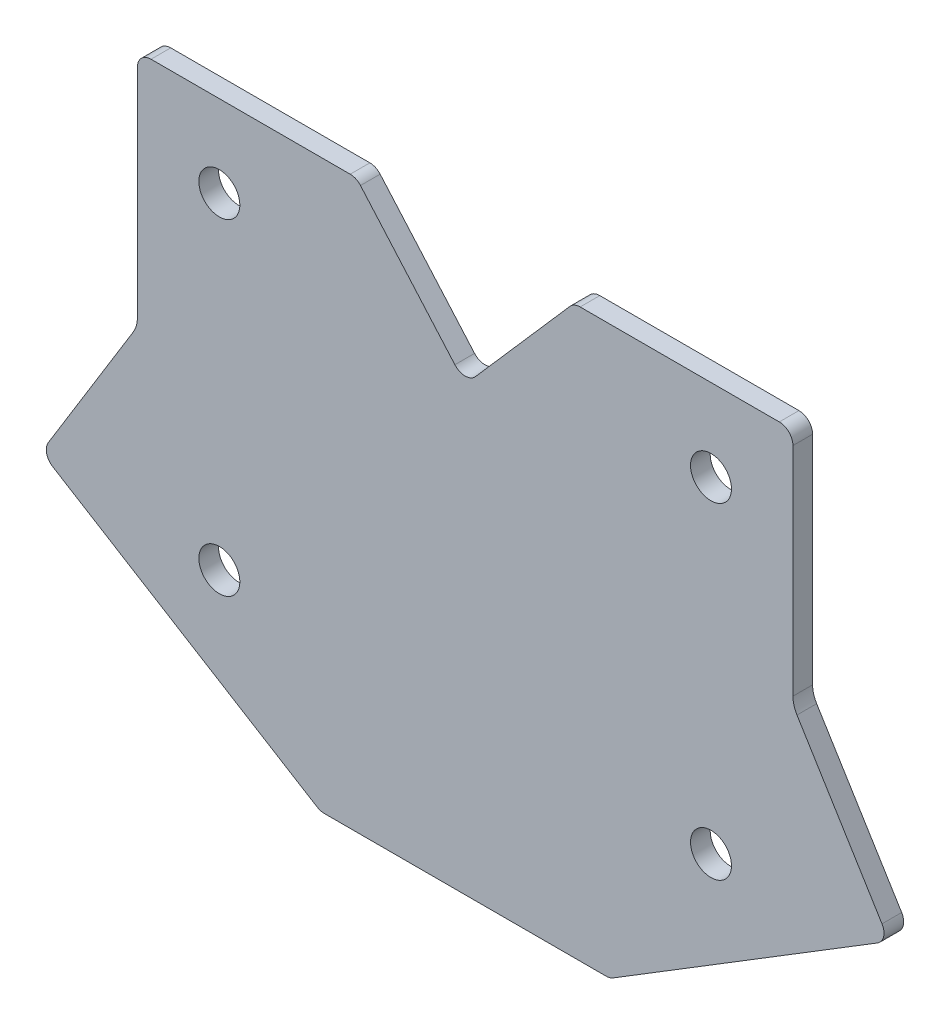
ISO-10303-21;
HEADER;
FILE_DESCRIPTION(('STEP AP214'),'2;1');
FILE_NAME('part.step','',(''),(''),'','','');
FILE_SCHEMA(('AUTOMOTIVE_DESIGN { 1 0 10303 214 1 1 1 1 }'));
ENDSEC;
DATA;
#1=APPLICATION_CONTEXT('core data for automotive mechanical design processes');
#2=APPLICATION_PROTOCOL_DEFINITION('international standard','automotive_design',2000,#1);
#3=PRODUCT_CONTEXT('',#1,'mechanical');
#4=PRODUCT('Part','Part','',(#3));
#5=PRODUCT_RELATED_PRODUCT_CATEGORY('part','',(#4));
#6=PRODUCT_DEFINITION_FORMATION('','',#4);
#7=PRODUCT_DEFINITION_CONTEXT('part definition',#1,'design');
#8=PRODUCT_DEFINITION('design','',#6,#7);
#9=PRODUCT_DEFINITION_SHAPE('','',#8);
#10=(LENGTH_UNIT() NAMED_UNIT(*) SI_UNIT(.MILLI.,.METRE.));
#11=(NAMED_UNIT(*) PLANE_ANGLE_UNIT() SI_UNIT($,.RADIAN.));
#12=(NAMED_UNIT(*) SI_UNIT($,.STERADIAN.) SOLID_ANGLE_UNIT());
#13=UNCERTAINTY_MEASURE_WITH_UNIT(LENGTH_MEASURE(1.E-05),#10,'distance_accuracy_value','');
#14=(GEOMETRIC_REPRESENTATION_CONTEXT(3) GLOBAL_UNCERTAINTY_ASSIGNED_CONTEXT((#13)) GLOBAL_UNIT_ASSIGNED_CONTEXT((#10,
#11,#12)) REPRESENTATION_CONTEXT('',''));
#15=CARTESIAN_POINT('',(0.,0.,0.));
#16=DIRECTION('',(0.,0.,1.));
#17=DIRECTION('',(1.,0.,0.));
#18=AXIS2_PLACEMENT_3D('',#15,#16,#17);
#19=CARTESIAN_POINT('',(-13.3633572147386,330.923698319184,-10.0795852621912));
#20=DIRECTION('',(0.,0.,1.));
#21=DIRECTION('',(1.,0.,0.));
#22=AXIS2_PLACEMENT_3D('',#19,#20,#21);
#23=CYLINDRICAL_SURFACE('',#22,1.5875);
#24=CARTESIAN_POINT('',(-13.3633572147386,330.923698319184,21.336));
#25=DIRECTION('',(0.,0.,1.));
#26=DIRECTION('',(1.,0.,0.));
#27=AXIS2_PLACEMENT_3D('',#24,#25,#26);
#28=CIRCLE('',#27,1.5875);
#29=CARTESIAN_POINT('',(-12.1680962513508,331.968450672329,21.336));
#30=VERTEX_POINT('',#29);
#31=CARTESIAN_POINT('',(-13.3633572147386,332.511198319184,21.336));
#32=VERTEX_POINT('',#31);
#33=EDGE_CURVE('E156',#30,#32,#28,.T.);
#34=ORIENTED_EDGE('',*,*,#33,.F.);
#35=DIRECTION('',(0.,0.,1.));
#36=VECTOR('',#35,1.);
#37=CARTESIAN_POINT('',(-12.1680962513508,331.968450672329,-10.0795852621912));
#38=LINE('',#37,#36);
#39=CARTESIAN_POINT('',(-12.1680962513508,331.968450672329,19.05));
#40=VERTEX_POINT('',#39);
#41=EDGE_CURVE('E243',#30,#40,#38,.F.);
#42=ORIENTED_EDGE('',*,*,#41,.T.);
#43=CARTESIAN_POINT('',(-13.3633572147386,330.923698319184,19.05));
#44=DIRECTION('',(0.,0.,1.));
#45=DIRECTION('',(1.,0.,0.));
#46=AXIS2_PLACEMENT_3D('',#43,#44,#45);
#47=CIRCLE('',#46,1.5875);
#48=CARTESIAN_POINT('',(-13.3633572147386,332.511198319184,19.05));
#49=VERTEX_POINT('',#48);
#50=EDGE_CURVE('E20',#40,#49,#47,.T.);
#51=ORIENTED_EDGE('',*,*,#50,.T.);
#52=DIRECTION('',(0.,0.,-1.));
#53=VECTOR('',#52,1.);
#54=CARTESIAN_POINT('',(-13.3633572147386,332.511198319184,21.336));
#55=LINE('',#54,#53);
#56=EDGE_CURVE('E237',#49,#32,#55,.F.);
#57=ORIENTED_EDGE('',*,*,#56,.T.);
#58=EDGE_LOOP('',(#34,#42,#51,#57));
#59=FACE_BOUND('',#58,.T.);
#60=ADVANCED_FACE('F17',(#59),#23,.T.);
#61=CARTESIAN_POINT('',(-47.1010606119022,287.12232454962,21.336));
#62=DIRECTION('',(0.,0.,-1.));
#63=DIRECTION('',(-1.,0.,0.));
#64=AXIS2_PLACEMENT_3D('',#61,#62,#63);
#65=CYLINDRICAL_SURFACE('',#64,1.5875);
#66=CARTESIAN_POINT('',(-47.1010606119022,287.12232454962,19.05));
#67=DIRECTION('',(0.,0.,-1.));
#68=DIRECTION('',(-1.,0.,0.));
#69=AXIS2_PLACEMENT_3D('',#66,#67,#68);
#70=CIRCLE('',#69,1.5875);
#71=CARTESIAN_POINT('',(-48.4535516847272,287.953543021461,19.05));
#72=VERTEX_POINT('',#71);
#73=CARTESIAN_POINT('',(-47.9322790837426,285.769833476795,19.05));
#74=VERTEX_POINT('',#73);
#75=EDGE_CURVE('E324',#72,#74,#70,.F.);
#76=ORIENTED_EDGE('',*,*,#75,.T.);
#77=DIRECTION('',(0.,0.,1.));
#78=VECTOR('',#77,1.);
#79=CARTESIAN_POINT('',(-47.9322790837426,285.769833476795,21.336));
#80=LINE('',#79,#78);
#81=CARTESIAN_POINT('',(-47.9322790837426,285.769833476795,21.336));
#82=VERTEX_POINT('',#81);
#83=EDGE_CURVE('E212',#74,#82,#80,.T.);
#84=ORIENTED_EDGE('',*,*,#83,.T.);
#85=CARTESIAN_POINT('',(-47.1010606119022,287.12232454962,21.336));
#86=DIRECTION('',(0.,0.,-1.));
#87=DIRECTION('',(-1.,0.,0.));
#88=AXIS2_PLACEMENT_3D('',#85,#86,#87);
#89=CIRCLE('',#88,1.5875);
#90=CARTESIAN_POINT('',(-48.4535516847272,287.953543021461,21.336));
#91=VERTEX_POINT('',#90);
#92=EDGE_CURVE('E317',#91,#82,#89,.F.);
#93=ORIENTED_EDGE('',*,*,#92,.F.);
#94=DIRECTION('',(0.,0.,1.));
#95=VECTOR('',#94,1.);
#96=CARTESIAN_POINT('',(-48.4535516847272,287.953543021461,21.336));
#97=LINE('',#96,#95);
#98=EDGE_CURVE('E218',#91,#72,#97,.F.);
#99=ORIENTED_EDGE('',*,*,#98,.T.);
#100=EDGE_LOOP('',(#76,#84,#93,#99));
#101=FACE_BOUND('',#100,.T.);
#102=ADVANCED_FACE('F429',(#101),#65,.T.);
#103=CARTESIAN_POINT('',(-16.3761533438558,268.239308624467,21.336));
#104=DIRECTION('',(0.,0.,-1.));
#105=DIRECTION('',(-1.,0.,0.));
#106=AXIS2_PLACEMENT_3D('',#103,#104,#105);
#107=CYLINDRICAL_SURFACE('',#106,1.5875);
#108=CARTESIAN_POINT('',(-16.3761533438558,268.239308624467,19.05));
#109=DIRECTION('',(0.,0.,-1.));
#110=DIRECTION('',(-1.,0.,0.));
#111=AXIS2_PLACEMENT_3D('',#108,#109,#110);
#112=CIRCLE('',#111,1.5875);
#113=CARTESIAN_POINT('',(-17.2073718156962,266.886817551642,19.05));
#114=VERTEX_POINT('',#113);
#115=CARTESIAN_POINT('',(-16.3761533438558,266.651808624467,19.05));
#116=VERTEX_POINT('',#115);
#117=EDGE_CURVE('E323',#114,#116,#112,.F.);
#118=ORIENTED_EDGE('',*,*,#117,.T.);
#119=DIRECTION('',(0.,0.,1.));
#120=VECTOR('',#119,1.);
#121=CARTESIAN_POINT('',(-16.3761533438558,266.651808624467,21.336));
#122=LINE('',#121,#120);
#123=CARTESIAN_POINT('',(-16.3761533438558,266.651808624467,21.336));
#124=VERTEX_POINT('',#123);
#125=EDGE_CURVE('E205',#116,#124,#122,.T.);
#126=ORIENTED_EDGE('',*,*,#125,.T.);
#127=CARTESIAN_POINT('',(-16.3761533438558,268.239308624467,21.336));
#128=DIRECTION('',(0.,0.,-1.));
#129=DIRECTION('',(-1.,0.,0.));
#130=AXIS2_PLACEMENT_3D('',#127,#128,#129);
#131=CIRCLE('',#130,1.5875);
#132=CARTESIAN_POINT('',(-17.2073718156962,266.886817551642,21.336));
#133=VERTEX_POINT('',#132);
#134=EDGE_CURVE('E315',#133,#124,#131,.F.);
#135=ORIENTED_EDGE('',*,*,#134,.F.);
#136=DIRECTION('',(0.,0.,1.));
#137=VECTOR('',#136,1.);
#138=CARTESIAN_POINT('',(-17.2073718156962,266.886817551642,21.336));
#139=LINE('',#138,#137);
#140=EDGE_CURVE('E215',#133,#114,#139,.F.);
#141=ORIENTED_EDGE('',*,*,#140,.T.);
#142=EDGE_LOOP('',(#118,#126,#135,#141));
#143=FACE_BOUND('',#142,.T.);
#144=ADVANCED_FACE('F422',(#143),#107,.T.);
#145=CARTESIAN_POINT('',(16.3761533438557,268.239308624467,21.336));
#146=DIRECTION('',(0.,0.,-1.));
#147=DIRECTION('',(-1.,0.,0.));
#148=AXIS2_PLACEMENT_3D('',#145,#146,#147);
#149=CYLINDRICAL_SURFACE('',#148,1.5875);
#150=CARTESIAN_POINT('',(16.3761533438557,268.239308624467,19.05));
#151=DIRECTION('',(0.,0.,-1.));
#152=DIRECTION('',(-1.,0.,0.));
#153=AXIS2_PLACEMENT_3D('',#150,#151,#152);
#154=CIRCLE('',#153,1.5875);
#155=CARTESIAN_POINT('',(16.3761533438557,266.651808624467,19.05));
#156=VERTEX_POINT('',#155);
#157=CARTESIAN_POINT('',(17.2073718156961,266.886817551642,19.05));
#158=VERTEX_POINT('',#157);
#159=EDGE_CURVE('E321',#156,#158,#154,.F.);
#160=ORIENTED_EDGE('',*,*,#159,.T.);
#161=DIRECTION('',(0.,0.,1.));
#162=VECTOR('',#161,1.);
#163=CARTESIAN_POINT('',(17.2073718156961,266.886817551642,21.336));
#164=LINE('',#163,#162);
#165=CARTESIAN_POINT('',(17.2073718156961,266.886817551642,21.336));
#166=VERTEX_POINT('',#165);
#167=EDGE_CURVE('E200',#158,#166,#164,.T.);
#168=ORIENTED_EDGE('',*,*,#167,.T.);
#169=CARTESIAN_POINT('',(16.3761533438557,268.239308624467,21.336));
#170=DIRECTION('',(0.,0.,-1.));
#171=DIRECTION('',(-1.,0.,0.));
#172=AXIS2_PLACEMENT_3D('',#169,#170,#171);
#173=CIRCLE('',#172,1.5875);
#174=CARTESIAN_POINT('',(16.3761533438557,266.651808624467,21.336));
#175=VERTEX_POINT('',#174);
#176=EDGE_CURVE('E313',#175,#166,#173,.F.);
#177=ORIENTED_EDGE('',*,*,#176,.F.);
#178=DIRECTION('',(0.,0.,1.));
#179=VECTOR('',#178,1.);
#180=CARTESIAN_POINT('',(16.3761533438557,266.651808624467,21.336));
#181=LINE('',#180,#179);
#182=EDGE_CURVE('E204',#175,#156,#181,.F.);
#183=ORIENTED_EDGE('',*,*,#182,.T.);
#184=EDGE_LOOP('',(#160,#168,#177,#183));
#185=FACE_BOUND('',#184,.T.);
#186=ADVANCED_FACE('F412',(#185),#149,.T.);
#187=CARTESIAN_POINT('',(13.3633572147386,330.923698319184,21.336));
#188=DIRECTION('',(0.,0.,1.));
#189=DIRECTION('',(1.,0.,0.));
#190=AXIS2_PLACEMENT_3D('',#187,#188,#189);
#191=CYLINDRICAL_SURFACE('',#190,1.5875);
#192=CARTESIAN_POINT('',(13.3633572147386,330.923698319184,21.336));
#193=DIRECTION('',(0.,0.,1.));
#194=DIRECTION('',(1.,0.,0.));
#195=AXIS2_PLACEMENT_3D('',#192,#193,#194);
#196=CIRCLE('',#195,1.5875);
#197=CARTESIAN_POINT('',(13.3633572147386,332.511198319184,21.336));
#198=VERTEX_POINT('',#197);
#199=CARTESIAN_POINT('',(12.1680962513509,331.968450672329,21.336));
#200=VERTEX_POINT('',#199);
#201=EDGE_CURVE('E148',#198,#200,#196,.T.);
#202=ORIENTED_EDGE('',*,*,#201,.F.);
#203=DIRECTION('',(0.,0.,-1.));
#204=VECTOR('',#203,1.);
#205=CARTESIAN_POINT('',(13.3633572147386,332.511198319184,21.336));
#206=LINE('',#205,#204);
#207=CARTESIAN_POINT('',(13.3633572147386,332.511198319184,19.05));
#208=VERTEX_POINT('',#207);
#209=EDGE_CURVE('E170',#198,#208,#206,.T.);
#210=ORIENTED_EDGE('',*,*,#209,.T.);
#211=CARTESIAN_POINT('',(13.3633572147386,330.923698319184,19.05));
#212=DIRECTION('',(0.,0.,1.));
#213=DIRECTION('',(1.,0.,0.));
#214=AXIS2_PLACEMENT_3D('',#211,#212,#213);
#215=CIRCLE('',#214,1.5875);
#216=CARTESIAN_POINT('',(12.1680962513509,331.968450672329,19.05));
#217=VERTEX_POINT('',#216);
#218=EDGE_CURVE('E35',#208,#217,#215,.T.);
#219=ORIENTED_EDGE('',*,*,#218,.T.);
#220=DIRECTION('',(0.,0.,1.));
#221=VECTOR('',#220,1.);
#222=CARTESIAN_POINT('',(12.1680962513508,331.968450672329,-10.0795852621912));
#223=LINE('',#222,#221);
#224=EDGE_CURVE('E162',#217,#200,#223,.T.);
#225=ORIENTED_EDGE('',*,*,#224,.T.);
#226=EDGE_LOOP('',(#202,#210,#219,#225));
#227=FACE_BOUND('',#226,.T.);
#228=ADVANCED_FACE('F168',(#227),#191,.T.);
#229=CARTESIAN_POINT('',(-41.275,305.697662129823,21.336));
#230=DIRECTION('',(0.,0.,1.));
#231=DIRECTION('',(1.,0.,0.));
#232=AXIS2_PLACEMENT_3D('',#229,#230,#231);
#233=PLANE('',#232);
#234=CARTESIAN_POINT('',(-28.5749999999999,322.986198319184,21.336));
#235=DIRECTION('',(0.,0.,-1.));
#236=DIRECTION('',(-1.,0.,0.));
#237=AXIS2_PLACEMENT_3D('',#234,#235,#236);
#238=CIRCLE('',#237,2.38125000000002);
#239=CARTESIAN_POINT('',(-30.9562499999999,322.986198319184,21.336));
#240=VERTEX_POINT('',#239);
#241=EDGE_CURVE('E296',#240,#240,#238,.T.);
#242=ORIENTED_EDGE('',*,*,#241,.T.);
#243=EDGE_LOOP('',(#242));
#244=FACE_BOUND('',#243,.T.);
#245=CARTESIAN_POINT('',(28.5749999999999,322.986198319184,21.336));
#246=DIRECTION('',(0.,0.,-1.));
#247=DIRECTION('',(-1.,0.,0.));
#248=AXIS2_PLACEMENT_3D('',#245,#246,#247);
#249=CIRCLE('',#248,2.38125000000002);
#250=CARTESIAN_POINT('',(26.1937499999999,322.986198319184,21.336));
#251=VERTEX_POINT('',#250);
#252=EDGE_CURVE('E302',#251,#251,#249,.T.);
#253=ORIENTED_EDGE('',*,*,#252,.T.);
#254=EDGE_LOOP('',(#253));
#255=FACE_BOUND('',#254,.T.);
#256=CARTESIAN_POINT('',(28.5749999999999,285.053236925106,21.336));
#257=DIRECTION('',(0.,0.,-1.));
#258=DIRECTION('',(-1.,0.,0.));
#259=AXIS2_PLACEMENT_3D('',#256,#257,#258);
#260=CIRCLE('',#259,2.38125000000002);
#261=CARTESIAN_POINT('',(26.1937499999999,285.053236925106,21.336));
#262=VERTEX_POINT('',#261);
#263=EDGE_CURVE('E166',#262,#262,#260,.T.);
#264=ORIENTED_EDGE('',*,*,#263,.T.);
#265=EDGE_LOOP('',(#264));
#266=FACE_BOUND('',#265,.T.);
#267=CARTESIAN_POINT('',(-28.5749999999999,285.053236925106,21.336));
#268=DIRECTION('',(0.,0.,-1.));
#269=DIRECTION('',(-1.,0.,0.));
#270=AXIS2_PLACEMENT_3D('',#267,#268,#269);
#271=CIRCLE('',#270,2.38125000000002);
#272=CARTESIAN_POINT('',(-30.9562499999999,285.053236925106,21.336));
#273=VERTEX_POINT('',#272);
#274=EDGE_CURVE('E299',#273,#273,#271,.T.);
#275=ORIENTED_EDGE('',*,*,#274,.T.);
#276=EDGE_LOOP('',(#275));
#277=FACE_BOUND('',#276,.T.);
#278=DIRECTION('',(0.,1.,0.));
#279=VECTOR('',#278,1.);
#280=CARTESIAN_POINT('',(38.1,305.697662129823,21.336));
#281=LINE('',#280,#279);
#282=CARTESIAN_POINT('',(38.1,305.697662129823,21.336));
#283=VERTEX_POINT('',#282);
#284=CARTESIAN_POINT('',(38.1,330.923698319184,21.336));
#285=VERTEX_POINT('',#284);
#286=EDGE_CURVE('E187',#283,#285,#281,.T.);
#287=ORIENTED_EDGE('',*,*,#286,.T.);
#288=CARTESIAN_POINT('',(36.5125,330.923698319184,21.336));
#289=DIRECTION('',(0.,0.,-1.));
#290=DIRECTION('',(-1.,0.,0.));
#291=AXIS2_PLACEMENT_3D('',#288,#289,#290);
#292=CIRCLE('',#291,1.5875);
#293=CARTESIAN_POINT('',(36.5125,332.511198319184,21.336));
#294=VERTEX_POINT('',#293);
#295=EDGE_CURVE('E183',#294,#285,#292,.T.);
#296=ORIENTED_EDGE('',*,*,#295,.F.);
#297=DIRECTION('',(1.,0.,0.));
#298=VECTOR('',#297,1.);
#299=CARTESIAN_POINT('',(-38.0999999999999,332.511198319184,21.336));
#300=LINE('',#299,#298);
#301=EDGE_CURVE('E154',#294,#198,#300,.F.);
#302=ORIENTED_EDGE('',*,*,#301,.T.);
#303=ORIENTED_EDGE('',*,*,#201,.T.);
#304=DIRECTION('',(0.658111718516371,0.752920291897774,0.));
#305=VECTOR('',#304,1.);
#306=CARTESIAN_POINT('',(0.,318.047400000171,21.336));
#307=LINE('',#306,#305);
#308=CARTESIAN_POINT('',(1.1952609633877,319.414852072711,21.336));
#309=VERTEX_POINT('',#308);
#310=EDGE_CURVE('E152',#200,#309,#307,.F.);
#311=ORIENTED_EDGE('',*,*,#310,.T.);
#312=CARTESIAN_POINT('',(0.,320.459604425855,21.336));
#313=DIRECTION('',(0.,0.,-1.));
#314=DIRECTION('',(-1.,0.,0.));
#315=AXIS2_PLACEMENT_3D('',#312,#313,#314);
#316=CIRCLE('',#315,1.5875);
#317=CARTESIAN_POINT('',(-1.19526096338775,319.414852072711,21.336));
#318=VERTEX_POINT('',#317);
#319=EDGE_CURVE('E244',#309,#318,#316,.T.);
#320=ORIENTED_EDGE('',*,*,#319,.T.);
#321=DIRECTION('',(0.658111718516369,-0.752920291897775,0.));
#322=VECTOR('',#321,1.);
#323=CARTESIAN_POINT('',(-12.6425005016233,332.511198319184,21.336));
#324=LINE('',#323,#322);
#325=EDGE_CURVE('E241',#318,#30,#324,.F.);
#326=ORIENTED_EDGE('',*,*,#325,.T.);
#327=ORIENTED_EDGE('',*,*,#33,.T.);
#328=DIRECTION('',(1.,0.,0.));
#329=VECTOR('',#328,1.);
#330=CARTESIAN_POINT('',(-38.0999999999999,332.511198319184,21.336));
#331=LINE('',#330,#329);
#332=CARTESIAN_POINT('',(-36.5124999999999,332.511198319184,21.336));
#333=VERTEX_POINT('',#332);
#334=EDGE_CURVE('E240',#32,#333,#331,.F.);
#335=ORIENTED_EDGE('',*,*,#334,.T.);
#336=CARTESIAN_POINT('',(-36.5124999999999,330.923698319184,21.336));
#337=DIRECTION('',(0.,0.,-1.));
#338=DIRECTION('',(-1.,0.,0.));
#339=AXIS2_PLACEMENT_3D('',#336,#337,#338);
#340=CIRCLE('',#339,1.5875);
#341=CARTESIAN_POINT('',(-38.0999999999999,330.923698319184,21.336));
#342=VERTEX_POINT('',#341);
#343=EDGE_CURVE('E236',#342,#333,#340,.T.);
#344=ORIENTED_EDGE('',*,*,#343,.F.);
#345=DIRECTION('',(0.,1.,0.));
#346=VECTOR('',#345,1.);
#347=CARTESIAN_POINT('',(-38.1,305.697662129823,21.336));
#348=LINE('',#347,#346);
#349=CARTESIAN_POINT('',(-38.1,305.697662129823,21.336));
#350=VERTEX_POINT('',#349);
#351=EDGE_CURVE('E229',#342,#350,#348,.F.);
#352=ORIENTED_EDGE('',*,*,#351,.T.);
#353=CARTESIAN_POINT('',(-41.275,305.697662129823,21.336));
#354=DIRECTION('',(0.,0.,-1.));
#355=DIRECTION('',(-1.,0.,0.));
#356=AXIS2_PLACEMENT_3D('',#353,#354,#355);
#357=CIRCLE('',#356,3.17499999999999);
#358=CARTESIAN_POINT('',(-38.57001785435,304.035225186142,21.336));
#359=VERTEX_POINT('',#358);
#360=EDGE_CURVE('E223',#350,#359,#357,.T.);
#361=ORIENTED_EDGE('',*,*,#360,.T.);
#362=DIRECTION('',(0.52360218698606,0.851962880519694,0.));
#363=VECTOR('',#362,1.);
#364=CARTESIAN_POINT('',(-49.2847701565676,286.601051948636,21.336));
#365=LINE('',#364,#363);
#366=EDGE_CURVE('E222',#359,#91,#365,.F.);
#367=ORIENTED_EDGE('',*,*,#366,.T.);
#368=ORIENTED_EDGE('',*,*,#92,.T.);
#369=DIRECTION('',(-0.851962880519694,0.523602186986061,0.));
#370=VECTOR('',#369,1.);
#371=CARTESIAN_POINT('',(-49.2847701565676,286.601051948636,21.336));
#372=LINE('',#371,#370);
#373=EDGE_CURVE('E209',#82,#133,#372,.F.);
#374=ORIENTED_EDGE('',*,*,#373,.T.);
#375=ORIENTED_EDGE('',*,*,#134,.T.);
#376=DIRECTION('',(1.,0.,0.));
#377=VECTOR('',#376,1.);
#378=CARTESIAN_POINT('',(-16.8249844087674,266.651808624467,21.336));
#379=LINE('',#378,#377);
#380=EDGE_CURVE('E208',#124,#175,#379,.T.);
#381=ORIENTED_EDGE('',*,*,#380,.T.);
#382=ORIENTED_EDGE('',*,*,#176,.T.);
#383=DIRECTION('',(-0.851962880519693,-0.523602186986061,0.));
#384=VECTOR('',#383,1.);
#385=CARTESIAN_POINT('',(16.8249844087673,266.651808624467,21.336));
#386=LINE('',#385,#384);
#387=CARTESIAN_POINT('',(47.9322790837426,285.769833476795,21.336));
#388=VERTEX_POINT('',#387);
#389=EDGE_CURVE('E203',#166,#388,#386,.F.);
#390=ORIENTED_EDGE('',*,*,#389,.T.);
#391=CARTESIAN_POINT('',(47.1010606119022,287.12232454962,21.336));
#392=DIRECTION('',(0.,0.,-1.));
#393=DIRECTION('',(-1.,0.,0.));
#394=AXIS2_PLACEMENT_3D('',#391,#392,#393);
#395=CIRCLE('',#394,1.5875);
#396=CARTESIAN_POINT('',(48.4535516847272,287.953543021461,21.336));
#397=VERTEX_POINT('',#396);
#398=EDGE_CURVE('E199',#397,#388,#395,.T.);
#399=ORIENTED_EDGE('',*,*,#398,.F.);
#400=DIRECTION('',(0.523602186986061,-0.851962880519694,0.));
#401=VECTOR('',#400,1.);
#402=CARTESIAN_POINT('',(49.2847701565676,286.601051948636,21.336));
#403=LINE('',#402,#401);
#404=CARTESIAN_POINT('',(38.57001785435,304.035225186142,21.336));
#405=VERTEX_POINT('',#404);
#406=EDGE_CURVE('E192',#397,#405,#403,.F.);
#407=ORIENTED_EDGE('',*,*,#406,.T.);
#408=CARTESIAN_POINT('',(41.275,305.697662129823,21.336));
#409=DIRECTION('',(0.,0.,-1.));
#410=DIRECTION('',(-1.,0.,0.));
#411=AXIS2_PLACEMENT_3D('',#408,#409,#410);
#412=CIRCLE('',#411,3.17499999999998);
#413=EDGE_CURVE('E188',#405,#283,#412,.T.);
#414=ORIENTED_EDGE('',*,*,#413,.T.);
#415=EDGE_LOOP('',(#287,#296,#302,#303,#311,#320,#326,#327,#335,#344,#352,#361,#367,#368,#374,
#375,#381,#382,#390,#399,#407,#414));
#416=FACE_BOUND('',#415,.T.);
#417=ADVANCED_FACE('F151',(#244,#255,#266,#277,#416),#233,.T.);
#418=CARTESIAN_POINT('',(0.,320.459604425855,-10.0795852621912));
#419=DIRECTION('',(0.,0.,-1.));
#420=DIRECTION('',(-1.,0.,0.));
#421=AXIS2_PLACEMENT_3D('',#418,#419,#420);
#422=CYLINDRICAL_SURFACE('',#421,1.5875);
#423=DIRECTION('',(0.,0.,1.));
#424=VECTOR('',#423,1.);
#425=CARTESIAN_POINT('',(-1.19526096338775,319.414852072711,-10.0795852621912));
#426=LINE('',#425,#424);
#427=CARTESIAN_POINT('',(-1.19526096338774,319.414852072711,19.05));
#428=VERTEX_POINT('',#427);
#429=EDGE_CURVE('E76',#428,#318,#426,.T.);
#430=ORIENTED_EDGE('',*,*,#429,.T.);
#431=ORIENTED_EDGE('',*,*,#319,.F.);
#432=DIRECTION('',(0.,0.,1.));
#433=VECTOR('',#432,1.);
#434=CARTESIAN_POINT('',(1.1952609633877,319.414852072711,-10.0795852621912));
#435=LINE('',#434,#433);
#436=CARTESIAN_POINT('',(1.1952609633877,319.414852072711,19.05));
#437=VERTEX_POINT('',#436);
#438=EDGE_CURVE('E165',#309,#437,#435,.F.);
#439=ORIENTED_EDGE('',*,*,#438,.T.);
#440=CARTESIAN_POINT('',(0.,320.459604425855,19.05));
#441=DIRECTION('',(0.,0.,-1.));
#442=DIRECTION('',(-1.,0.,0.));
#443=AXIS2_PLACEMENT_3D('',#440,#441,#442);
#444=CIRCLE('',#443,1.5875);
#445=EDGE_CURVE('E293',#437,#428,#444,.T.);
#446=ORIENTED_EDGE('',*,*,#445,.T.);
#447=EDGE_LOOP('',(#430,#431,#439,#446));
#448=FACE_BOUND('',#447,.T.);
#449=ADVANCED_FACE('F359',(#448),#422,.F.);
#450=CARTESIAN_POINT('',(-12.6425005016233,332.511198319184,-10.0795852621912));
#451=DIRECTION('',(-0.752920291897775,-0.658111718516369,0.));
#452=DIRECTION('',(0.658111718516369,-0.752920291897775,0.));
#453=AXIS2_PLACEMENT_3D('',#450,#451,#452);
#454=PLANE('',#453);
#455=ORIENTED_EDGE('',*,*,#429,.F.);
#456=DIRECTION('',(-0.65811171851637,0.752920291897775,0.));
#457=VECTOR('',#456,1.);
#458=CARTESIAN_POINT('',(-1.19526096338775,319.414852072711,19.05));
#459=LINE('',#458,#457);
#460=EDGE_CURVE('E173',#428,#40,#459,.T.);
#461=ORIENTED_EDGE('',*,*,#460,.T.);
#462=ORIENTED_EDGE('',*,*,#41,.F.);
#463=ORIENTED_EDGE('',*,*,#325,.F.);
#464=EDGE_LOOP('',(#455,#461,#462,#463));
#465=FACE_BOUND('',#464,.T.);
#466=ADVANCED_FACE('F360',(#465),#454,.F.);
#467=CARTESIAN_POINT('',(-38.0999999999999,332.511198319184,21.336));
#468=DIRECTION('',(0.,-1.,0.));
#469=DIRECTION('',(0.,0.,-1.));
#470=AXIS2_PLACEMENT_3D('',#467,#468,#469);
#471=PLANE('',#470);
#472=ORIENTED_EDGE('',*,*,#56,.F.);
#473=DIRECTION('',(1.,0.,0.));
#474=VECTOR('',#473,1.);
#475=CARTESIAN_POINT('',(-41.275,332.511198319184,19.05));
#476=LINE('',#475,#474);
#477=CARTESIAN_POINT('',(-36.5124999999999,332.511198319184,19.05));
#478=VERTEX_POINT('',#477);
#479=EDGE_CURVE('E292',#49,#478,#476,.F.);
#480=ORIENTED_EDGE('',*,*,#479,.T.);
#481=DIRECTION('',(0.,0.,-1.));
#482=VECTOR('',#481,1.);
#483=CARTESIAN_POINT('',(-36.5124999999999,332.511198319184,21.336));
#484=LINE('',#483,#482);
#485=EDGE_CURVE('E233',#333,#478,#484,.T.);
#486=ORIENTED_EDGE('',*,*,#485,.F.);
#487=ORIENTED_EDGE('',*,*,#334,.F.);
#488=EDGE_LOOP('',(#472,#480,#486,#487));
#489=FACE_BOUND('',#488,.T.);
#490=ADVANCED_FACE('F333',(#489),#471,.F.);
#491=CARTESIAN_POINT('',(-36.5124999999999,330.923698319184,21.336));
#492=DIRECTION('',(0.,0.,-1.));
#493=DIRECTION('',(-1.,0.,0.));
#494=AXIS2_PLACEMENT_3D('',#491,#492,#493);
#495=CYLINDRICAL_SURFACE('',#494,1.5875);
#496=CARTESIAN_POINT('',(-36.5124999999999,330.923698319184,19.05));
#497=DIRECTION('',(0.,0.,-1.));
#498=DIRECTION('',(-1.,0.,0.));
#499=AXIS2_PLACEMENT_3D('',#496,#497,#498);
#500=CIRCLE('',#499,1.5875);
#501=CARTESIAN_POINT('',(-38.0999999999999,330.923698319184,19.05));
#502=VERTEX_POINT('',#501);
#503=EDGE_CURVE('E289',#478,#502,#500,.F.);
#504=ORIENTED_EDGE('',*,*,#503,.T.);
#505=DIRECTION('',(0.,0.,1.));
#506=VECTOR('',#505,1.);
#507=CARTESIAN_POINT('',(-38.0999999999999,330.923698319184,21.336));
#508=LINE('',#507,#506);
#509=EDGE_CURVE('E230',#502,#342,#508,.T.);
#510=ORIENTED_EDGE('',*,*,#509,.T.);
#511=ORIENTED_EDGE('',*,*,#343,.T.);
#512=ORIENTED_EDGE('',*,*,#485,.T.);
#513=EDGE_LOOP('',(#504,#510,#511,#512));
#514=FACE_BOUND('',#513,.T.);
#515=ADVANCED_FACE('F363',(#514),#495,.T.);
#516=CARTESIAN_POINT('',(-38.1,305.697662129823,21.336));
#517=DIRECTION('',(1.,0.,0.));
#518=DIRECTION('',(0.,1.,0.));
#519=AXIS2_PLACEMENT_3D('',#516,#517,#518);
#520=PLANE('',#519);
#521=ORIENTED_EDGE('',*,*,#509,.F.);
#522=DIRECTION('',(0.,1.,0.));
#523=VECTOR('',#522,1.);
#524=CARTESIAN_POINT('',(-38.0999999999999,305.697662129823,19.05));
#525=LINE('',#524,#523);
#526=CARTESIAN_POINT('',(-38.1,305.697662129823,19.05));
#527=VERTEX_POINT('',#526);
#528=EDGE_CURVE('E288',#502,#527,#525,.F.);
#529=ORIENTED_EDGE('',*,*,#528,.T.);
#530=DIRECTION('',(0.,0.,-1.));
#531=VECTOR('',#530,1.);
#532=CARTESIAN_POINT('',(-38.1,305.697662129823,21.336));
#533=LINE('',#532,#531);
#534=EDGE_CURVE('E226',#527,#350,#533,.F.);
#535=ORIENTED_EDGE('',*,*,#534,.T.);
#536=ORIENTED_EDGE('',*,*,#351,.F.);
#537=EDGE_LOOP('',(#521,#529,#535,#536));
#538=FACE_BOUND('',#537,.T.);
#539=ADVANCED_FACE('F437',(#538),#520,.F.);
#540=CARTESIAN_POINT('',(-41.275,305.697662129823,21.336));
#541=DIRECTION('',(0.,0.,-1.));
#542=DIRECTION('',(-1.,0.,0.));
#543=AXIS2_PLACEMENT_3D('',#540,#541,#542);
#544=CYLINDRICAL_SURFACE('',#543,3.17499999999999);
#545=DIRECTION('',(0.,0.,1.));
#546=VECTOR('',#545,1.);
#547=CARTESIAN_POINT('',(-38.57001785435,304.035225186142,21.336));
#548=LINE('',#547,#546);
#549=CARTESIAN_POINT('',(-38.57001785435,304.035225186142,19.05));
#550=VERTEX_POINT('',#549);
#551=EDGE_CURVE('E219',#550,#359,#548,.T.);
#552=ORIENTED_EDGE('',*,*,#551,.T.);
#553=ORIENTED_EDGE('',*,*,#360,.F.);
#554=ORIENTED_EDGE('',*,*,#534,.F.);
#555=CARTESIAN_POINT('',(-41.275,305.697662129823,19.05));
#556=DIRECTION('',(0.,0.,-1.));
#557=DIRECTION('',(-1.,0.,0.));
#558=AXIS2_PLACEMENT_3D('',#555,#556,#557);
#559=CIRCLE('',#558,3.17499999999999);
#560=EDGE_CURVE('E284',#527,#550,#559,.T.);
#561=ORIENTED_EDGE('',*,*,#560,.T.);
#562=EDGE_LOOP('',(#552,#553,#554,#561));
#563=FACE_BOUND('',#562,.T.);
#564=ADVANCED_FACE('F435',(#563),#544,.F.);
#565=CARTESIAN_POINT('',(-49.2847701565676,286.601051948636,21.336));
#566=DIRECTION('',(0.851962880519694,-0.52360218698606,0.));
#567=DIRECTION('',(0.52360218698606,0.851962880519694,0.));
#568=AXIS2_PLACEMENT_3D('',#565,#566,#567);
#569=PLANE('',#568);
#570=ORIENTED_EDGE('',*,*,#98,.F.);
#571=ORIENTED_EDGE('',*,*,#366,.F.);
#572=ORIENTED_EDGE('',*,*,#551,.F.);
#573=DIRECTION('',(-0.52360218698606,-0.851962880519694,0.));
#574=VECTOR('',#573,1.);
#575=CARTESIAN_POINT('',(-38.57001785435,304.035225186142,19.05));
#576=LINE('',#575,#574);
#577=EDGE_CURVE('E287',#550,#72,#576,.T.);
#578=ORIENTED_EDGE('',*,*,#577,.T.);
#579=EDGE_LOOP('',(#570,#571,#572,#578));
#580=FACE_BOUND('',#579,.T.);
#581=ADVANCED_FACE('F432',(#580),#569,.F.);
#582=CARTESIAN_POINT('',(-49.2847701565676,286.601051948636,21.336));
#583=DIRECTION('',(0.523602186986061,0.851962880519694,0.));
#584=DIRECTION('',(-0.851962880519694,0.523602186986061,0.));
#585=AXIS2_PLACEMENT_3D('',#582,#583,#584);
#586=PLANE('',#585);
#587=ORIENTED_EDGE('',*,*,#83,.F.);
#588=DIRECTION('',(0.851962880519694,-0.523602186986061,0.));
#589=VECTOR('',#588,1.);
#590=CARTESIAN_POINT('',(-47.9322790837426,285.769833476795,19.05));
#591=LINE('',#590,#589);
#592=EDGE_CURVE('E343',#74,#114,#591,.T.);
#593=ORIENTED_EDGE('',*,*,#592,.T.);
#594=ORIENTED_EDGE('',*,*,#140,.F.);
#595=ORIENTED_EDGE('',*,*,#373,.F.);
#596=EDGE_LOOP('',(#587,#593,#594,#595));
#597=FACE_BOUND('',#596,.T.);
#598=ADVANCED_FACE('F425',(#597),#586,.F.);
#599=CARTESIAN_POINT('',(-16.8249844087674,266.651808624467,21.336));
#600=DIRECTION('',(0.,1.,0.));
#601=DIRECTION('',(0.,0.,1.));
#602=AXIS2_PLACEMENT_3D('',#599,#600,#601);
#603=PLANE('',#602);
#604=ORIENTED_EDGE('',*,*,#182,.F.);
#605=ORIENTED_EDGE('',*,*,#380,.F.);
#606=ORIENTED_EDGE('',*,*,#125,.F.);
#607=DIRECTION('',(1.,0.,0.));
#608=VECTOR('',#607,1.);
#609=CARTESIAN_POINT('',(-41.275,266.651808624467,19.05));
#610=LINE('',#609,#608);
#611=EDGE_CURVE('E346',#116,#156,#610,.T.);
#612=ORIENTED_EDGE('',*,*,#611,.T.);
#613=EDGE_LOOP('',(#604,#605,#606,#612));
#614=FACE_BOUND('',#613,.T.);
#615=ADVANCED_FACE('F418',(#614),#603,.F.);
#616=CARTESIAN_POINT('',(16.8249844087673,266.651808624467,21.336));
#617=DIRECTION('',(-0.523602186986061,0.851962880519693,0.));
#618=DIRECTION('',(-0.851962880519693,-0.523602186986061,0.));
#619=AXIS2_PLACEMENT_3D('',#616,#617,#618);
#620=PLANE('',#619);
#621=DIRECTION('',(0.,0.,-1.));
#622=VECTOR('',#621,1.);
#623=CARTESIAN_POINT('',(47.9322790837426,285.769833476795,21.336));
#624=LINE('',#623,#622);
#625=CARTESIAN_POINT('',(47.9322790837426,285.769833476795,19.05));
#626=VERTEX_POINT('',#625);
#627=EDGE_CURVE('E196',#388,#626,#624,.T.);
#628=ORIENTED_EDGE('',*,*,#627,.F.);
#629=ORIENTED_EDGE('',*,*,#389,.F.);
#630=ORIENTED_EDGE('',*,*,#167,.F.);
#631=DIRECTION('',(0.851962880519693,0.523602186986062,0.));
#632=VECTOR('',#631,1.);
#633=CARTESIAN_POINT('',(17.2073718156961,266.886817551642,19.05));
#634=LINE('',#633,#632);
#635=EDGE_CURVE('E283',#158,#626,#634,.T.);
#636=ORIENTED_EDGE('',*,*,#635,.T.);
#637=EDGE_LOOP('',(#628,#629,#630,#636));
#638=FACE_BOUND('',#637,.T.);
#639=ADVANCED_FACE('F409',(#638),#620,.F.);
#640=CARTESIAN_POINT('',(47.1010606119022,287.12232454962,21.336));
#641=DIRECTION('',(0.,0.,-1.));
#642=DIRECTION('',(-1.,0.,0.));
#643=AXIS2_PLACEMENT_3D('',#640,#641,#642);
#644=CYLINDRICAL_SURFACE('',#643,1.5875);
#645=CARTESIAN_POINT('',(47.1010606119022,287.12232454962,19.05));
#646=DIRECTION('',(0.,0.,-1.));
#647=DIRECTION('',(-1.,0.,0.));
#648=AXIS2_PLACEMENT_3D('',#645,#646,#647);
#649=CIRCLE('',#648,1.5875);
#650=CARTESIAN_POINT('',(48.4535516847272,287.953543021461,19.05));
#651=VERTEX_POINT('',#650);
#652=EDGE_CURVE('E280',#626,#651,#649,.F.);
#653=ORIENTED_EDGE('',*,*,#652,.T.);
#654=DIRECTION('',(0.,0.,1.));
#655=VECTOR('',#654,1.);
#656=CARTESIAN_POINT('',(48.4535516847272,287.953543021461,21.336));
#657=LINE('',#656,#655);
#658=EDGE_CURVE('E193',#651,#397,#657,.T.);
#659=ORIENTED_EDGE('',*,*,#658,.T.);
#660=ORIENTED_EDGE('',*,*,#398,.T.);
#661=ORIENTED_EDGE('',*,*,#627,.T.);
#662=EDGE_LOOP('',(#653,#659,#660,#661));
#663=FACE_BOUND('',#662,.T.);
#664=ADVANCED_FACE('F404',(#663),#644,.T.);
#665=CARTESIAN_POINT('',(49.2847701565676,286.601051948636,21.336));
#666=DIRECTION('',(-0.851962880519694,-0.523602186986061,0.));
#667=DIRECTION('',(0.523602186986061,-0.851962880519694,0.));
#668=AXIS2_PLACEMENT_3D('',#665,#666,#667);
#669=PLANE('',#668);
#670=ORIENTED_EDGE('',*,*,#658,.F.);
#671=DIRECTION('',(-0.523602186986061,0.851962880519693,0.));
#672=VECTOR('',#671,1.);
#673=CARTESIAN_POINT('',(48.4535516847272,287.953543021461,19.05));
#674=LINE('',#673,#672);
#675=CARTESIAN_POINT('',(38.57001785435,304.035225186142,19.05));
#676=VERTEX_POINT('',#675);
#677=EDGE_CURVE('E279',#651,#676,#674,.T.);
#678=ORIENTED_EDGE('',*,*,#677,.T.);
#679=DIRECTION('',(0.,0.,-1.));
#680=VECTOR('',#679,1.);
#681=CARTESIAN_POINT('',(38.5700178543499,304.035225186142,21.336));
#682=LINE('',#681,#680);
#683=EDGE_CURVE('E189',#676,#405,#682,.F.);
#684=ORIENTED_EDGE('',*,*,#683,.T.);
#685=ORIENTED_EDGE('',*,*,#406,.F.);
#686=EDGE_LOOP('',(#670,#678,#684,#685));
#687=FACE_BOUND('',#686,.T.);
#688=ADVANCED_FACE('F401',(#687),#669,.F.);
#689=CARTESIAN_POINT('',(41.275,305.697662129823,21.336));
#690=DIRECTION('',(0.,0.,-1.));
#691=DIRECTION('',(-1.,0.,0.));
#692=AXIS2_PLACEMENT_3D('',#689,#690,#691);
#693=CYLINDRICAL_SURFACE('',#692,3.17499999999998);
#694=DIRECTION('',(0.,0.,1.));
#695=VECTOR('',#694,1.);
#696=CARTESIAN_POINT('',(38.1,305.697662129823,21.336));
#697=LINE('',#696,#695);
#698=CARTESIAN_POINT('',(38.1,305.697662129823,19.05));
#699=VERTEX_POINT('',#698);
#700=EDGE_CURVE('E184',#699,#283,#697,.T.);
#701=ORIENTED_EDGE('',*,*,#700,.T.);
#702=ORIENTED_EDGE('',*,*,#413,.F.);
#703=ORIENTED_EDGE('',*,*,#683,.F.);
#704=CARTESIAN_POINT('',(41.275,305.697662129823,19.05));
#705=DIRECTION('',(0.,0.,-1.));
#706=DIRECTION('',(-1.,0.,0.));
#707=AXIS2_PLACEMENT_3D('',#704,#705,#706);
#708=CIRCLE('',#707,3.17499999999998);
#709=EDGE_CURVE('E276',#676,#699,#708,.T.);
#710=ORIENTED_EDGE('',*,*,#709,.T.);
#711=EDGE_LOOP('',(#701,#702,#703,#710));
#712=FACE_BOUND('',#711,.T.);
#713=ADVANCED_FACE('F397',(#712),#693,.F.);
#714=CARTESIAN_POINT('',(38.1,305.697662129823,21.336));
#715=DIRECTION('',(-1.,0.,0.));
#716=DIRECTION('',(0.,0.,1.));
#717=AXIS2_PLACEMENT_3D('',#714,#715,#716);
#718=PLANE('',#717);
#719=DIRECTION('',(0.,0.,-1.));
#720=VECTOR('',#719,1.);
#721=CARTESIAN_POINT('',(38.1,330.923698319184,21.336));
#722=LINE('',#721,#720);
#723=CARTESIAN_POINT('',(38.1,330.923698319184,19.05));
#724=VERTEX_POINT('',#723);
#725=EDGE_CURVE('E179',#285,#724,#722,.T.);
#726=ORIENTED_EDGE('',*,*,#725,.F.);
#727=ORIENTED_EDGE('',*,*,#286,.F.);
#728=ORIENTED_EDGE('',*,*,#700,.F.);
#729=DIRECTION('',(0.,1.,0.));
#730=VECTOR('',#729,1.);
#731=CARTESIAN_POINT('',(38.1,305.697662129823,19.05));
#732=LINE('',#731,#730);
#733=EDGE_CURVE('E275',#699,#724,#732,.T.);
#734=ORIENTED_EDGE('',*,*,#733,.T.);
#735=EDGE_LOOP('',(#726,#727,#728,#734));
#736=FACE_BOUND('',#735,.T.);
#737=ADVANCED_FACE('F394',(#736),#718,.F.);
#738=CARTESIAN_POINT('',(36.5125,330.923698319184,21.336));
#739=DIRECTION('',(0.,0.,-1.));
#740=DIRECTION('',(-1.,0.,0.));
#741=AXIS2_PLACEMENT_3D('',#738,#739,#740);
#742=CYLINDRICAL_SURFACE('',#741,1.5875);
#743=CARTESIAN_POINT('',(36.5125,330.923698319184,19.05));
#744=DIRECTION('',(0.,0.,-1.));
#745=DIRECTION('',(-1.,0.,0.));
#746=AXIS2_PLACEMENT_3D('',#743,#744,#745);
#747=CIRCLE('',#746,1.5875);
#748=CARTESIAN_POINT('',(36.5125,332.511198319184,19.05));
#749=VERTEX_POINT('',#748);
#750=EDGE_CURVE('E271',#724,#749,#747,.F.);
#751=ORIENTED_EDGE('',*,*,#750,.T.);
#752=DIRECTION('',(0.,0.,-1.));
#753=VECTOR('',#752,1.);
#754=CARTESIAN_POINT('',(36.5125,332.511198319184,21.336));
#755=LINE('',#754,#753);
#756=EDGE_CURVE('E176',#749,#294,#755,.F.);
#757=ORIENTED_EDGE('',*,*,#756,.T.);
#758=ORIENTED_EDGE('',*,*,#295,.T.);
#759=ORIENTED_EDGE('',*,*,#725,.T.);
#760=EDGE_LOOP('',(#751,#757,#758,#759));
#761=FACE_BOUND('',#760,.T.);
#762=ADVANCED_FACE('F389',(#761),#742,.T.);
#763=CARTESIAN_POINT('',(-38.0999999999999,332.511198319184,21.336));
#764=DIRECTION('',(0.,-1.,0.));
#765=DIRECTION('',(0.,0.,-1.));
#766=AXIS2_PLACEMENT_3D('',#763,#764,#765);
#767=PLANE('',#766);
#768=ORIENTED_EDGE('',*,*,#209,.F.);
#769=ORIENTED_EDGE('',*,*,#301,.F.);
#770=ORIENTED_EDGE('',*,*,#756,.F.);
#771=DIRECTION('',(1.,0.,0.));
#772=VECTOR('',#771,1.);
#773=CARTESIAN_POINT('',(-41.275,332.511198319184,19.05));
#774=LINE('',#773,#772);
#775=EDGE_CURVE('E274',#749,#208,#774,.F.);
#776=ORIENTED_EDGE('',*,*,#775,.T.);
#777=EDGE_LOOP('',(#768,#769,#770,#776));
#778=FACE_BOUND('',#777,.T.);
#779=ADVANCED_FACE('F439',(#778),#767,.F.);
#780=CARTESIAN_POINT('',(0.,318.047400000171,-10.0795852621912));
#781=DIRECTION('',(0.752920291897774,-0.658111718516371,0.));
#782=DIRECTION('',(0.658111718516371,0.752920291897774,0.));
#783=AXIS2_PLACEMENT_3D('',#780,#781,#782);
#784=PLANE('',#783);
#785=ORIENTED_EDGE('',*,*,#224,.F.);
#786=DIRECTION('',(-0.658111718516371,-0.752920291897774,0.));
#787=VECTOR('',#786,1.);
#788=CARTESIAN_POINT('',(12.1680962513508,331.968450672329,19.05));
#789=LINE('',#788,#787);
#790=EDGE_CURVE('E270',#217,#437,#789,.T.);
#791=ORIENTED_EDGE('',*,*,#790,.T.);
#792=ORIENTED_EDGE('',*,*,#438,.F.);
#793=ORIENTED_EDGE('',*,*,#310,.F.);
#794=EDGE_LOOP('',(#785,#791,#792,#793));
#795=FACE_BOUND('',#794,.T.);
#796=ADVANCED_FACE('F160',(#795),#784,.F.);
#797=CARTESIAN_POINT('',(28.5749999999999,285.053236925106,21.336));
#798=DIRECTION('',(0.,0.,-1.));
#799=DIRECTION('',(-1.,0.,0.));
#800=AXIS2_PLACEMENT_3D('',#797,#798,#799);
#801=CYLINDRICAL_SURFACE('',#800,2.38125000000002);
#802=CARTESIAN_POINT('',(28.5749999999999,285.053236925106,19.05));
#803=DIRECTION('',(0.,0.,-1.));
#804=DIRECTION('',(-1.,0.,0.));
#805=AXIS2_PLACEMENT_3D('',#802,#803,#804);
#806=CIRCLE('',#805,2.38125000000002);
#807=CARTESIAN_POINT('',(26.1937499999999,285.053236925106,19.05));
#808=VERTEX_POINT('',#807);
#809=EDGE_CURVE('E267',#808,#808,#806,.T.);
#810=ORIENTED_EDGE('',*,*,#809,.T.);
#811=EDGE_LOOP('',(#810));
#812=FACE_BOUND('',#811,.T.);
#813=ORIENTED_EDGE('',*,*,#263,.F.);
#814=EDGE_LOOP('',(#813));
#815=FACE_BOUND('',#814,.T.);
#816=ADVANCED_FACE('F447',(#812,#815),#801,.F.);
#817=CARTESIAN_POINT('',(28.5749999999999,322.986198319184,21.336));
#818=DIRECTION('',(0.,0.,-1.));
#819=DIRECTION('',(-1.,0.,0.));
#820=AXIS2_PLACEMENT_3D('',#817,#818,#819);
#821=CYLINDRICAL_SURFACE('',#820,2.38125000000002);
#822=CARTESIAN_POINT('',(28.5749999999999,322.986198319184,19.05));
#823=DIRECTION('',(0.,0.,-1.));
#824=DIRECTION('',(-1.,0.,0.));
#825=AXIS2_PLACEMENT_3D('',#822,#823,#824);
#826=CIRCLE('',#825,2.38125000000002);
#827=CARTESIAN_POINT('',(26.1937499999999,322.986198319184,19.05));
#828=VERTEX_POINT('',#827);
#829=EDGE_CURVE('E264',#828,#828,#826,.T.);
#830=ORIENTED_EDGE('',*,*,#829,.T.);
#831=EDGE_LOOP('',(#830));
#832=FACE_BOUND('',#831,.T.);
#833=ORIENTED_EDGE('',*,*,#252,.F.);
#834=EDGE_LOOP('',(#833));
#835=FACE_BOUND('',#834,.T.);
#836=ADVANCED_FACE('F465',(#832,#835),#821,.F.);
#837=CARTESIAN_POINT('',(-28.5749999999999,285.053236925106,21.336));
#838=DIRECTION('',(0.,0.,-1.));
#839=DIRECTION('',(-1.,0.,0.));
#840=AXIS2_PLACEMENT_3D('',#837,#838,#839);
#841=CYLINDRICAL_SURFACE('',#840,2.38125000000002);
#842=CARTESIAN_POINT('',(-28.5749999999999,285.053236925106,19.05));
#843=DIRECTION('',(0.,0.,-1.));
#844=DIRECTION('',(-1.,0.,0.));
#845=AXIS2_PLACEMENT_3D('',#842,#843,#844);
#846=CIRCLE('',#845,2.38125000000002);
#847=CARTESIAN_POINT('',(-30.9562499999999,285.053236925106,19.05));
#848=VERTEX_POINT('',#847);
#849=EDGE_CURVE('E26',#848,#848,#846,.T.);
#850=ORIENTED_EDGE('',*,*,#849,.T.);
#851=EDGE_LOOP('',(#850));
#852=FACE_BOUND('',#851,.T.);
#853=ORIENTED_EDGE('',*,*,#274,.F.);
#854=EDGE_LOOP('',(#853));
#855=FACE_BOUND('',#854,.T.);
#856=ADVANCED_FACE('F457',(#852,#855),#841,.F.);
#857=CARTESIAN_POINT('',(-28.5749999999999,322.986198319184,21.336));
#858=DIRECTION('',(0.,0.,-1.));
#859=DIRECTION('',(-1.,0.,0.));
#860=AXIS2_PLACEMENT_3D('',#857,#858,#859);
#861=CYLINDRICAL_SURFACE('',#860,2.38125000000002);
#862=CARTESIAN_POINT('',(-28.5749999999999,322.986198319184,19.05));
#863=DIRECTION('',(0.,0.,-1.));
#864=DIRECTION('',(-1.,0.,0.));
#865=AXIS2_PLACEMENT_3D('',#862,#863,#864);
#866=CIRCLE('',#865,2.38125000000002);
#867=CARTESIAN_POINT('',(-30.9562499999999,322.986198319184,19.05));
#868=VERTEX_POINT('',#867);
#869=EDGE_CURVE('E11',#868,#868,#866,.T.);
#870=ORIENTED_EDGE('',*,*,#869,.T.);
#871=EDGE_LOOP('',(#870));
#872=FACE_BOUND('',#871,.T.);
#873=ORIENTED_EDGE('',*,*,#241,.F.);
#874=EDGE_LOOP('',(#873));
#875=FACE_BOUND('',#874,.T.);
#876=ADVANCED_FACE('F451',(#872,#875),#861,.F.);
#877=CARTESIAN_POINT('',(-41.275,305.697662129823,19.05));
#878=DIRECTION('',(0.,0.,1.));
#879=DIRECTION('',(1.,0.,0.));
#880=AXIS2_PLACEMENT_3D('',#877,#878,#879);
#881=PLANE('',#880);
#882=ORIENTED_EDGE('',*,*,#869,.F.);
#883=EDGE_LOOP('',(#882));
#884=FACE_BOUND('',#883,.T.);
#885=ORIENTED_EDGE('',*,*,#849,.F.);
#886=EDGE_LOOP('',(#885));
#887=FACE_BOUND('',#886,.T.);
#888=ORIENTED_EDGE('',*,*,#829,.F.);
#889=EDGE_LOOP('',(#888));
#890=FACE_BOUND('',#889,.T.);
#891=ORIENTED_EDGE('',*,*,#809,.F.);
#892=EDGE_LOOP('',(#891));
#893=FACE_BOUND('',#892,.T.);
#894=ORIENTED_EDGE('',*,*,#218,.F.);
#895=ORIENTED_EDGE('',*,*,#775,.F.);
#896=ORIENTED_EDGE('',*,*,#750,.F.);
#897=ORIENTED_EDGE('',*,*,#733,.F.);
#898=ORIENTED_EDGE('',*,*,#709,.F.);
#899=ORIENTED_EDGE('',*,*,#677,.F.);
#900=ORIENTED_EDGE('',*,*,#652,.F.);
#901=ORIENTED_EDGE('',*,*,#635,.F.);
#902=ORIENTED_EDGE('',*,*,#159,.F.);
#903=ORIENTED_EDGE('',*,*,#611,.F.);
#904=ORIENTED_EDGE('',*,*,#117,.F.);
#905=ORIENTED_EDGE('',*,*,#592,.F.);
#906=ORIENTED_EDGE('',*,*,#75,.F.);
#907=ORIENTED_EDGE('',*,*,#577,.F.);
#908=ORIENTED_EDGE('',*,*,#560,.F.);
#909=ORIENTED_EDGE('',*,*,#528,.F.);
#910=ORIENTED_EDGE('',*,*,#503,.F.);
#911=ORIENTED_EDGE('',*,*,#479,.F.);
#912=ORIENTED_EDGE('',*,*,#50,.F.);
#913=ORIENTED_EDGE('',*,*,#460,.F.);
#914=ORIENTED_EDGE('',*,*,#445,.F.);
#915=ORIENTED_EDGE('',*,*,#790,.F.);
#916=EDGE_LOOP('',(#894,#895,#896,#897,#898,#899,#900,#901,#902,#903,#904,#905,#906,#907,#908,
#909,#910,#911,#912,#913,#914,#915));
#917=FACE_BOUND('',#916,.T.);
#918=ADVANCED_FACE('F336',(#884,#887,#890,#893,#917),#881,.F.);
#919=CLOSED_SHELL('',(#60,#102,#144,#186,#228,#417,#449,#466,#490,#515,#539,#564,#581,#598,#615,
#639,#664,#688,#713,#737,#762,#779,#796,#816,#836,#856,#876,#918));
#920=MANIFOLD_SOLID_BREP('B1',#919);
#921=ADVANCED_BREP_SHAPE_REPRESENTATION('',(#18,#920),#14);
#922=SHAPE_DEFINITION_REPRESENTATION(#9,#921);
ENDSEC;
END-ISO-10303-21;
